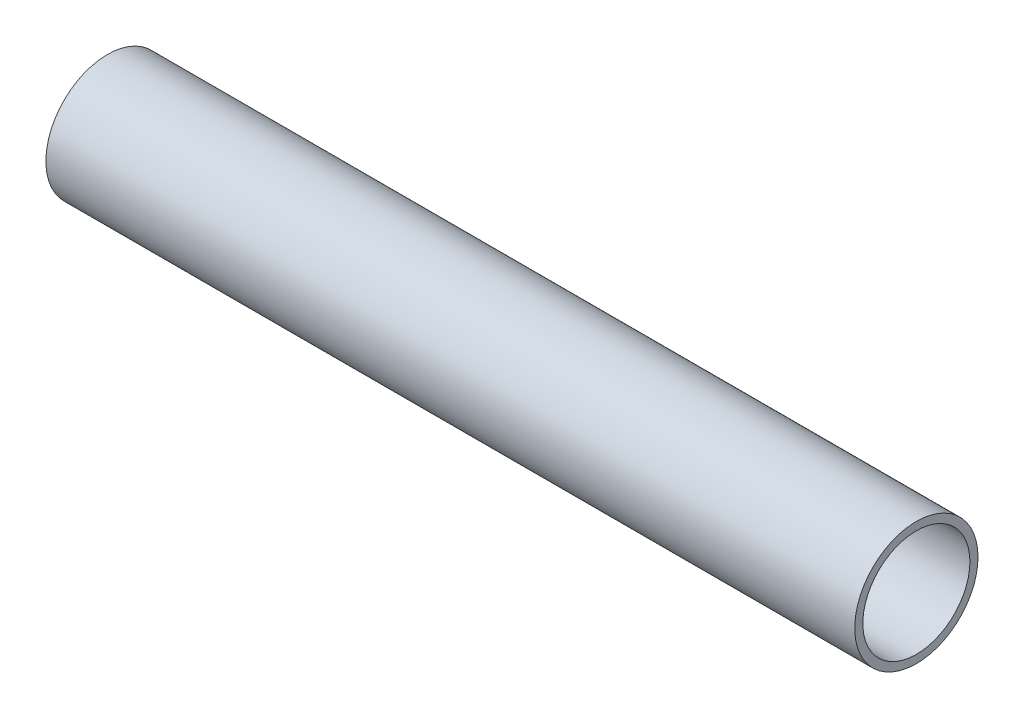
ISO-10303-21;
HEADER;
FILE_DESCRIPTION(('STEP AP214'),'2;1');
FILE_NAME('part.step','',(''),(''),'','','');
FILE_SCHEMA(('AUTOMOTIVE_DESIGN { 1 0 10303 214 1 1 1 1 }'));
ENDSEC;
DATA;
#1=APPLICATION_CONTEXT('core data for automotive mechanical design processes');
#2=APPLICATION_PROTOCOL_DEFINITION('international standard','automotive_design',2000,#1);
#3=PRODUCT_CONTEXT('',#1,'mechanical');
#4=PRODUCT('Part','Part','',(#3));
#5=PRODUCT_RELATED_PRODUCT_CATEGORY('part','',(#4));
#6=PRODUCT_DEFINITION_FORMATION('','',#4);
#7=PRODUCT_DEFINITION_CONTEXT('part definition',#1,'design');
#8=PRODUCT_DEFINITION('design','',#6,#7);
#9=PRODUCT_DEFINITION_SHAPE('','',#8);
#10=(LENGTH_UNIT() NAMED_UNIT(*) SI_UNIT(.MILLI.,.METRE.));
#11=(NAMED_UNIT(*) PLANE_ANGLE_UNIT() SI_UNIT($,.RADIAN.));
#12=(NAMED_UNIT(*) SI_UNIT($,.STERADIAN.) SOLID_ANGLE_UNIT());
#13=UNCERTAINTY_MEASURE_WITH_UNIT(LENGTH_MEASURE(1.E-05),#10,'distance_accuracy_value','');
#14=(GEOMETRIC_REPRESENTATION_CONTEXT(3) GLOBAL_UNCERTAINTY_ASSIGNED_CONTEXT((#13)) GLOBAL_UNIT_ASSIGNED_CONTEXT((#10,
#11,#12)) REPRESENTATION_CONTEXT('',''));
#15=CARTESIAN_POINT('',(0.,0.,0.));
#16=DIRECTION('',(0.,0.,1.));
#17=DIRECTION('',(1.,0.,0.));
#18=AXIS2_PLACEMENT_3D('',#15,#16,#17);
#19=CARTESIAN_POINT('',(1000.,0.,0.));
#20=DIRECTION('',(1.,0.,0.));
#21=DIRECTION('',(0.,0.,-1.));
#22=AXIS2_PLACEMENT_3D('',#19,#20,#21);
#23=PLANE('',#22);
#24=CARTESIAN_POINT('',(1000.,0.,0.));
#25=DIRECTION('',(1.,0.,0.));
#26=DIRECTION('',(0.,0.,-1.));
#27=AXIS2_PLACEMENT_3D('',#24,#25,#26);
#28=CIRCLE('',#27,76.2);
#29=CARTESIAN_POINT('',(1000.,0.,-76.2));
#30=VERTEX_POINT('',#29);
#31=EDGE_CURVE('E10',#30,#30,#28,.T.);
#32=ORIENTED_EDGE('',*,*,#31,.T.);
#33=EDGE_LOOP('',(#32));
#34=FACE_BOUND('',#33,.T.);
#35=CARTESIAN_POINT('',(1000.,0.,0.));
#36=DIRECTION('',(1.,0.,0.));
#37=DIRECTION('',(0.,0.,-1.));
#38=AXIS2_PLACEMENT_3D('',#35,#36,#37);
#39=CIRCLE('',#38,66.2);
#40=CARTESIAN_POINT('',(1000.,0.,-66.2));
#41=VERTEX_POINT('',#40);
#42=EDGE_CURVE('E56',#41,#41,#39,.T.);
#43=ORIENTED_EDGE('',*,*,#42,.F.);
#44=EDGE_LOOP('',(#43));
#45=FACE_BOUND('',#44,.T.);
#46=ADVANCED_FACE('F43',(#34,#45),#23,.T.);
#47=CARTESIAN_POINT('',(0.,0.,0.));
#48=DIRECTION('',(1.,0.,0.));
#49=DIRECTION('',(0.,0.,-1.));
#50=AXIS2_PLACEMENT_3D('',#47,#48,#49);
#51=PLANE('',#50);
#52=CARTESIAN_POINT('',(0.,0.,0.));
#53=DIRECTION('',(1.,0.,0.));
#54=DIRECTION('',(0.,0.,-1.));
#55=AXIS2_PLACEMENT_3D('',#52,#53,#54);
#56=CIRCLE('',#55,76.2);
#57=CARTESIAN_POINT('',(0.,0.,-76.2));
#58=VERTEX_POINT('',#57);
#59=EDGE_CURVE('E47',#58,#58,#56,.T.);
#60=ORIENTED_EDGE('',*,*,#59,.F.);
#61=EDGE_LOOP('',(#60));
#62=FACE_BOUND('',#61,.T.);
#63=CARTESIAN_POINT('',(0.,0.,0.));
#64=DIRECTION('',(1.,0.,0.));
#65=DIRECTION('',(0.,0.,-1.));
#66=AXIS2_PLACEMENT_3D('',#63,#64,#65);
#67=CIRCLE('',#66,66.2);
#68=CARTESIAN_POINT('',(0.,0.,-66.2));
#69=VERTEX_POINT('',#68);
#70=EDGE_CURVE('E58',#69,#69,#67,.T.);
#71=ORIENTED_EDGE('',*,*,#70,.T.);
#72=EDGE_LOOP('',(#71));
#73=FACE_BOUND('',#72,.T.);
#74=ADVANCED_FACE('F68',(#62,#73),#51,.F.);
#75=CARTESIAN_POINT('',(1000.,0.,0.));
#76=DIRECTION('',(-1.,0.,0.));
#77=DIRECTION('',(0.,0.,1.));
#78=AXIS2_PLACEMENT_3D('',#75,#76,#77);
#79=CYLINDRICAL_SURFACE('',#78,76.2);
#80=ORIENTED_EDGE('',*,*,#31,.F.);
#81=EDGE_LOOP('',(#80));
#82=FACE_BOUND('',#81,.T.);
#83=ORIENTED_EDGE('',*,*,#59,.T.);
#84=EDGE_LOOP('',(#83));
#85=FACE_BOUND('',#84,.T.);
#86=ADVANCED_FACE('F45',(#82,#85),#79,.T.);
#87=CARTESIAN_POINT('',(1000.,0.,0.));
#88=DIRECTION('',(-1.,0.,0.));
#89=DIRECTION('',(0.,0.,1.));
#90=AXIS2_PLACEMENT_3D('',#87,#88,#89);
#91=CYLINDRICAL_SURFACE('',#90,66.2);
#92=ORIENTED_EDGE('',*,*,#42,.T.);
#93=EDGE_LOOP('',(#92));
#94=FACE_BOUND('',#93,.T.);
#95=ORIENTED_EDGE('',*,*,#70,.F.);
#96=EDGE_LOOP('',(#95));
#97=FACE_BOUND('',#96,.T.);
#98=ADVANCED_FACE('F64',(#94,#97),#91,.F.);
#99=CLOSED_SHELL('',(#46,#74,#86,#98));
#100=MANIFOLD_SOLID_BREP('B2',#99);
#101=ADVANCED_BREP_SHAPE_REPRESENTATION('',(#18,#100),#14);
#102=SHAPE_DEFINITION_REPRESENTATION(#9,#101);
ENDSEC;
END-ISO-10303-21;
